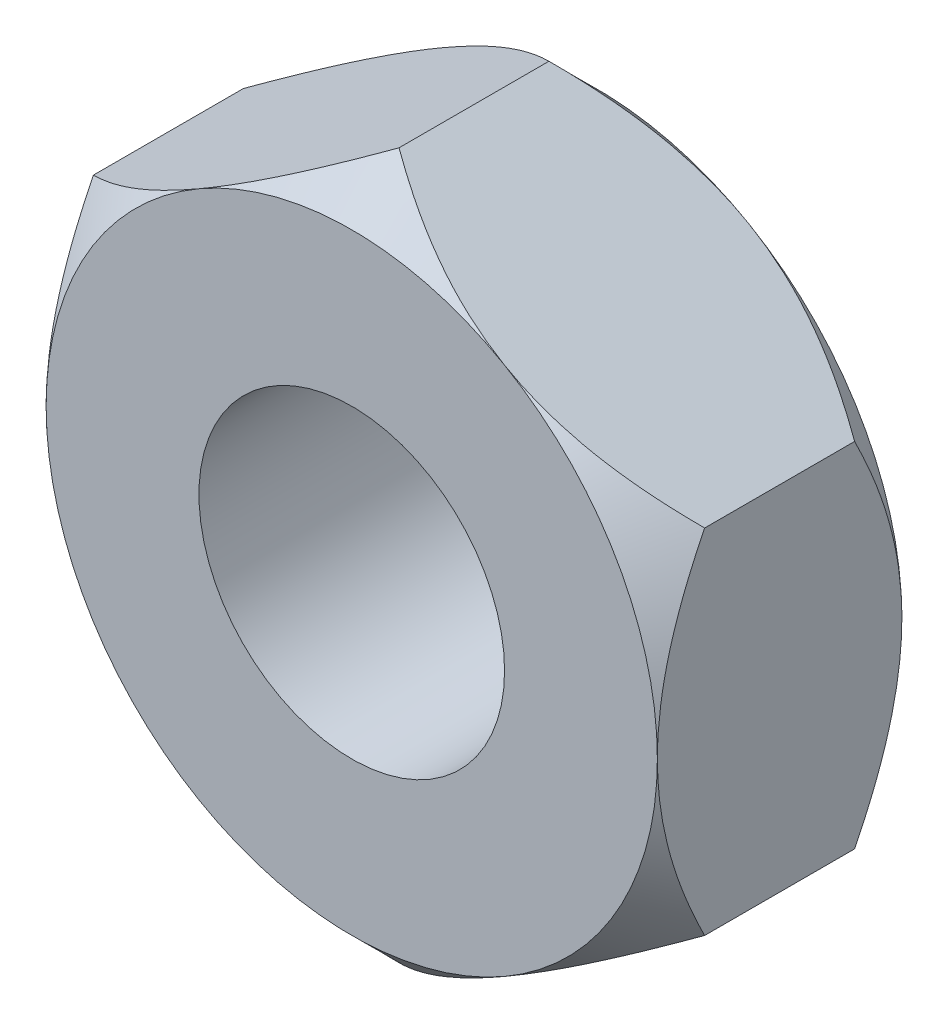
ISO-10303-21;
HEADER;
FILE_DESCRIPTION(('STEP AP214'),'2;1');
FILE_NAME('part.step','',(''),(''),'','','');
FILE_SCHEMA(('AUTOMOTIVE_DESIGN { 1 0 10303 214 1 1 1 1 }'));
ENDSEC;
DATA;
#1=APPLICATION_CONTEXT('core data for automotive mechanical design processes');
#2=APPLICATION_PROTOCOL_DEFINITION('international standard','automotive_design',2000,#1);
#3=PRODUCT_CONTEXT('',#1,'mechanical');
#4=PRODUCT('Part','Part','',(#3));
#5=PRODUCT_RELATED_PRODUCT_CATEGORY('part','',(#4));
#6=PRODUCT_DEFINITION_FORMATION('','',#4);
#7=PRODUCT_DEFINITION_CONTEXT('part definition',#1,'design');
#8=PRODUCT_DEFINITION('design','',#6,#7);
#9=PRODUCT_DEFINITION_SHAPE('','',#8);
#10=(LENGTH_UNIT() NAMED_UNIT(*) SI_UNIT(.MILLI.,.METRE.));
#11=(NAMED_UNIT(*) PLANE_ANGLE_UNIT() SI_UNIT($,.RADIAN.));
#12=(NAMED_UNIT(*) SI_UNIT($,.STERADIAN.) SOLID_ANGLE_UNIT());
#13=UNCERTAINTY_MEASURE_WITH_UNIT(LENGTH_MEASURE(1.E-05),#10,'distance_accuracy_value','');
#14=(GEOMETRIC_REPRESENTATION_CONTEXT(3) GLOBAL_UNCERTAINTY_ASSIGNED_CONTEXT((#13)) GLOBAL_UNIT_ASSIGNED_CONTEXT((#10,
#11,#12)) REPRESENTATION_CONTEXT('',''));
#15=CARTESIAN_POINT('',(0.,0.,0.));
#16=DIRECTION('',(0.,0.,1.));
#17=DIRECTION('',(1.,0.,0.));
#18=AXIS2_PLACEMENT_3D('',#15,#16,#17);
#19=CARTESIAN_POINT('',(2.5,1.44337567297407,2.));
#20=DIRECTION('',(-0.5,-0.866025403784439,0.));
#21=DIRECTION('',(0.866025403784439,-0.5,0.));
#22=AXIS2_PLACEMENT_3D('',#19,#20,#21);
#23=PLANE('',#22);
#24=CARTESIAN_POINT('',(-0.000199999999999123,2.88686681600197,0.386866822929891));
#25=CARTESIAN_POINT('',(0.0857382777877658,2.83725032818751,0.337292051302854));
#26=CARTESIAN_POINT('',(0.173113567275754,2.7868041812811,0.290628827310633));
#27=CARTESIAN_POINT('',(0.351281456165589,2.6839389026696,0.205189485986429));
#28=CARTESIAN_POINT('',(0.442091000681075,2.6315099876986,0.16646090835413));
#29=CARTESIAN_POINT('',(0.625204123126921,2.52578957716234,0.100118049845867));
#30=CARTESIAN_POINT('',(0.717461064529341,2.47252500720904,0.0723370144789845));
#31=CARTESIAN_POINT('',(0.904006008776286,2.3648232334321,0.0295345218587943));
#32=CARTESIAN_POINT('',(0.998288312566283,2.31038931995913,0.0144811126194724));
#33=CARTESIAN_POINT('',(1.16077825829185,2.21657570605387,0.000899068157609951));
#34=CARTESIAN_POINT('',(1.22877596788015,2.17731721011878,-0.00111155481107021));
#35=CARTESIAN_POINT('',(1.36466024116922,2.0988643883567,0.0022754631356168));
#36=CARTESIAN_POINT('',(1.43254675755224,2.05967008984862,0.00767570124794925));
#37=CARTESIAN_POINT('',(1.56767878823611,1.98165157555715,0.0255771343506008));
#38=CARTESIAN_POINT('',(1.63492349975356,1.94282782326097,0.0380862729946096));
#39=CARTESIAN_POINT('',(1.7682501008182,1.86585167424616,0.0695188479038358));
#40=CARTESIAN_POINT('',(1.83433207909966,1.82769922629678,0.0884417924449471));
#41=CARTESIAN_POINT('',(2.00359634669127,1.72997445583858,0.144618707356376));
#42=CARTESIAN_POINT('',(2.10572912222289,1.67100807039231,0.186107177544315));
#43=CARTESIAN_POINT('',(2.25590641494051,1.58430317001562,0.256145392671216));
#44=CARTESIAN_POINT('',(2.30539653988261,1.55573003305807,0.280753598064202));
#45=CARTESIAN_POINT('',(2.40346006383885,1.49911303110426,0.332213232663363));
#46=CARTESIAN_POINT('',(2.45203400349693,1.47106885396706,0.359063284727483));
#47=CARTESIAN_POINT('',(2.5002,1.44326020292023,0.386866822929891));
#48=B_SPLINE_CURVE_WITH_KNOTS('',3,(#24,#25,#26,#27,#28,#29,#30,#31,#32,#33,#34,#35,#36,#37,#38,
#39,#40,#41,#42,#43,#44,#45,#46,#47),.UNSPECIFIED.,.F.,.F.,(4,2,2,2,2,2,2,2,2,2,2,4),(0.,
0.333012085133924,0.667964518301397,0.997597032043298,1.32639954393844,1.56169424147168,
1.79707142102083,2.03271213522171,2.26833478775651,2.64260240809533,2.82922877818864,
3.01574133749025),.UNSPECIFIED.);
#49=CARTESIAN_POINT('',(0.,2.88675134594813,0.386751345948127));
#50=VERTEX_POINT('',#49);
#51=CARTESIAN_POINT('',(1.25,2.1650635094611,0.));
#52=VERTEX_POINT('',#51);
#53=EDGE_CURVE('E81',#50,#52,#48,.T.);
#54=ORIENTED_EDGE('',*,*,#53,.F.);
#55=DIRECTION('',(0.,0.,-1.));
#56=VECTOR('',#55,1.);
#57=CARTESIAN_POINT('',(0.,2.88675134594813,2.));
#58=LINE('',#57,#56);
#59=CARTESIAN_POINT('',(0.,2.88675134594813,1.61324865405187));
#60=VERTEX_POINT('',#59);
#61=EDGE_CURVE('E204',#60,#50,#58,.T.);
#62=ORIENTED_EDGE('',*,*,#61,.F.);
#63=CARTESIAN_POINT('',(2.5002,1.44326020292023,1.61313317707011));
#64=CARTESIAN_POINT('',(2.41426172221224,1.49287669073469,1.66270794869715));
#65=CARTESIAN_POINT('',(2.32688643272425,1.5433228376411,1.70937117268937));
#66=CARTESIAN_POINT('',(2.14871854383441,1.64618811625259,1.79481051401357));
#67=CARTESIAN_POINT('',(2.05790899931893,1.6986170312236,1.83353909164587));
#68=CARTESIAN_POINT('',(1.87479587687308,1.80433744175986,1.89988195015413));
#69=CARTESIAN_POINT('',(1.78253893547066,1.85760201171316,1.92766298552102));
#70=CARTESIAN_POINT('',(1.59599399122371,1.96530378549009,1.97046547814121));
#71=CARTESIAN_POINT('',(1.50171168743372,2.01973769896307,1.98551888738053));
#72=CARTESIAN_POINT('',(1.33922174170816,2.11355131286833,1.99910093184239));
#73=CARTESIAN_POINT('',(1.27122403211985,2.15280980880341,2.00111155481107));
#74=CARTESIAN_POINT('',(1.13533975883078,2.23126263056549,1.99772453686438));
#75=CARTESIAN_POINT('',(1.06745324244776,2.27045692907358,1.99232429875205));
#76=CARTESIAN_POINT('',(0.932321211763895,2.34847544336505,1.9744228656494));
#77=CARTESIAN_POINT('',(0.86507650024644,2.38729919566123,1.96191372700539));
#78=CARTESIAN_POINT('',(0.731749899181802,2.46427534467604,1.93048115209616));
#79=CARTESIAN_POINT('',(0.665667920900344,2.50242779262542,1.91155820755505));
#80=CARTESIAN_POINT('',(0.496403653308736,2.60015256308362,1.85538129264362));
#81=CARTESIAN_POINT('',(0.394270877777108,2.65911894852989,1.81389282245568));
#82=CARTESIAN_POINT('',(0.244093585059492,2.74582384890657,1.74385460732878));
#83=CARTESIAN_POINT('',(0.194603460117391,2.77439698586412,1.7192464019358));
#84=CARTESIAN_POINT('',(0.0965399361611536,2.83101398781794,1.66778676733664));
#85=CARTESIAN_POINT('',(0.0479659965030723,2.85905816495513,1.64093671527252));
#86=CARTESIAN_POINT('',(-0.000199999999999437,2.88686681600197,1.61313317707011));
#87=B_SPLINE_CURVE_WITH_KNOTS('',3,(#63,#64,#65,#66,#67,#68,#69,#70,#71,#72,#73,#74,#75,#76,#77,
#78,#79,#80,#81,#82,#83,#84,#85,#86),.UNSPECIFIED.,.F.,.F.,(4,2,2,2,2,2,2,2,2,2,2,4),(0.,
0.333012085133923,0.667964518301396,0.997597032043297,1.32639954393844,1.56169424147168,
1.79707142102083,2.0327121352217,2.2683347877565,2.64260240809533,2.82922877818864,
3.01574133749025),.UNSPECIFIED.);
#88=CARTESIAN_POINT('',(1.25,2.1650635094611,2.));
#89=VERTEX_POINT('',#88);
#90=EDGE_CURVE('E233',#89,#60,#87,.T.);
#91=ORIENTED_EDGE('',*,*,#90,.F.);
#92=CARTESIAN_POINT('',(2.5,1.44337567297407,1.61324865405187));
#93=VERTEX_POINT('',#92);
#94=EDGE_CURVE('E391',#93,#89,#87,.T.);
#95=ORIENTED_EDGE('',*,*,#94,.F.);
#96=DIRECTION('',(0.,0.,-1.));
#97=VECTOR('',#96,1.);
#98=CARTESIAN_POINT('',(2.5,1.44337567297407,2.));
#99=LINE('',#98,#97);
#100=CARTESIAN_POINT('',(2.5,1.44337567297407,0.386751345948127));
#101=VERTEX_POINT('',#100);
#102=EDGE_CURVE('E186',#93,#101,#99,.T.);
#103=ORIENTED_EDGE('',*,*,#102,.T.);
#104=EDGE_CURVE('E178',#52,#101,#48,.T.);
#105=ORIENTED_EDGE('',*,*,#104,.F.);
#106=EDGE_LOOP('',(#54,#62,#91,#95,#103,#105));
#107=FACE_BOUND('',#106,.T.);
#108=ADVANCED_FACE('F64',(#107),#23,.F.);
#109=CARTESIAN_POINT('',(0.,2.88675134594813,2.));
#110=DIRECTION('',(0.5,-0.866025403784439,0.));
#111=DIRECTION('',(0.866025403784439,0.5,0.));
#112=AXIS2_PLACEMENT_3D('',#109,#110,#111);
#113=PLANE('',#112);
#114=CARTESIAN_POINT('',(-2.5002,1.44326020292023,0.386866822929891));
#115=CARTESIAN_POINT('',(-2.41426172221224,1.49287669073469,0.337292051302855));
#116=CARTESIAN_POINT('',(-2.32688643272425,1.5433228376411,0.290628827310633));
#117=CARTESIAN_POINT('',(-2.14871854383441,1.64618811625259,0.205189485986428));
#118=CARTESIAN_POINT('',(-2.05790899931893,1.69861703122359,0.166460908354129));
#119=CARTESIAN_POINT('',(-1.87479587687308,1.80433744175986,0.100118049845866));
#120=CARTESIAN_POINT('',(-1.78253893547066,1.85760201171316,0.0723370144789839));
#121=CARTESIAN_POINT('',(-1.59599399122371,1.96530378549009,0.0295345218587938));
#122=CARTESIAN_POINT('',(-1.50171168743372,2.01973769896307,0.0144811126194717));
#123=CARTESIAN_POINT('',(-1.33922174170815,2.11355131286833,0.00089906815760948));
#124=CARTESIAN_POINT('',(-1.27122403211985,2.15280980880341,-0.00111155481107049));
#125=CARTESIAN_POINT('',(-1.13533975883078,2.23126263056549,0.00227546313561644));
#126=CARTESIAN_POINT('',(-1.06745324244776,2.27045692907358,0.00767570124794863));
#127=CARTESIAN_POINT('',(-0.932321211763894,2.34847544336505,0.0255771343505999));
#128=CARTESIAN_POINT('',(-0.86507650024644,2.38729919566123,0.0380862729946087));
#129=CARTESIAN_POINT('',(-0.731749899181801,2.46427534467604,0.0695188479038351));
#130=CARTESIAN_POINT('',(-0.665667920900343,2.50242779262542,0.0884417924449465));
#131=CARTESIAN_POINT('',(-0.496403653308735,2.60015256308362,0.144618707356375));
#132=CARTESIAN_POINT('',(-0.394270877777107,2.65911894852989,0.186107177544315));
#133=CARTESIAN_POINT('',(-0.244093585059491,2.74582384890657,0.256145392671216));
#134=CARTESIAN_POINT('',(-0.19460346011739,2.77439698586412,0.280753598064202));
#135=CARTESIAN_POINT('',(-0.0965399361611529,2.83101398781794,0.332213232663363));
#136=CARTESIAN_POINT('',(-0.0479659965030716,2.85905816495513,0.359063284727484));
#137=CARTESIAN_POINT('',(0.000200000000000612,2.88686681600197,0.386866822929892));
#138=B_SPLINE_CURVE_WITH_KNOTS('',3,(#114,#115,#116,#117,#118,#119,#120,#121,#122,#123,#124,
#125,#126,#127,#128,#129,#130,#131,#132,#133,#134,#135,#136,#137),.UNSPECIFIED.,.F.,.F.,(4,2,2,
2,2,2,2,2,2,2,2,4),(0.,0.333012085133924,0.667964518301397,0.997597032043299,1.32639954393844,
1.56169424147169,1.79707142102083,2.03271213522171,2.26833478775651,2.64260240809533,
2.82922877818864,3.01574133749025),.UNSPECIFIED.);
#139=CARTESIAN_POINT('',(-2.5,1.44337567297407,0.386751345948127));
#140=VERTEX_POINT('',#139);
#141=CARTESIAN_POINT('',(-1.25,2.1650635094611,0.));
#142=VERTEX_POINT('',#141);
#143=EDGE_CURVE('E88',#140,#142,#138,.T.);
#144=ORIENTED_EDGE('',*,*,#143,.F.);
#145=DIRECTION('',(0.,0.,-1.));
#146=VECTOR('',#145,1.);
#147=CARTESIAN_POINT('',(-2.5,1.44337567297407,2.));
#148=LINE('',#147,#146);
#149=CARTESIAN_POINT('',(-2.5,1.44337567297407,1.61324865405187));
#150=VERTEX_POINT('',#149);
#151=EDGE_CURVE('E200',#150,#140,#148,.T.);
#152=ORIENTED_EDGE('',*,*,#151,.F.);
#153=CARTESIAN_POINT('',(0.000200000000000938,2.88686681600197,1.61313317707011));
#154=CARTESIAN_POINT('',(-0.085738277787764,2.83725032818751,1.66270794869714));
#155=CARTESIAN_POINT('',(-0.173113567275753,2.7868041812811,1.70937117268937));
#156=CARTESIAN_POINT('',(-0.351281456165588,2.6839389026696,1.79481051401357));
#157=CARTESIAN_POINT('',(-0.442091000681074,2.6315099876986,1.83353909164587));
#158=CARTESIAN_POINT('',(-0.625204123126921,2.52578957716234,1.89988195015413));
#159=CARTESIAN_POINT('',(-0.71746106452934,2.47252500720904,1.92766298552102));
#160=CARTESIAN_POINT('',(-0.904006008776286,2.3648232334321,1.97046547814121));
#161=CARTESIAN_POINT('',(-0.998288312566284,2.31038931995913,1.98551888738053));
#162=CARTESIAN_POINT('',(-1.16077825829185,2.21657570605387,1.99910093184239));
#163=CARTESIAN_POINT('',(-1.22877596788015,2.17731721011878,2.00111155481107));
#164=CARTESIAN_POINT('',(-1.36466024116922,2.0988643883567,1.99772453686438));
#165=CARTESIAN_POINT('',(-1.43254675755224,2.05967008984862,1.99232429875205));
#166=CARTESIAN_POINT('',(-1.56767878823611,1.98165157555715,1.9744228656494));
#167=CARTESIAN_POINT('',(-1.63492349975356,1.94282782326097,1.96191372700539));
#168=CARTESIAN_POINT('',(-1.7682501008182,1.86585167424616,1.93048115209616));
#169=CARTESIAN_POINT('',(-1.83433207909966,1.82769922629678,1.91155820755505));
#170=CARTESIAN_POINT('',(-2.00359634669127,1.72997445583858,1.85538129264362));
#171=CARTESIAN_POINT('',(-2.10572912222289,1.67100807039231,1.81389282245568));
#172=CARTESIAN_POINT('',(-2.25590641494051,1.58430317001562,1.74385460732878));
#173=CARTESIAN_POINT('',(-2.30539653988261,1.55573003305807,1.7192464019358));
#174=CARTESIAN_POINT('',(-2.40346006383885,1.49911303110426,1.66778676733664));
#175=CARTESIAN_POINT('',(-2.45203400349693,1.47106885396706,1.64093671527252));
#176=CARTESIAN_POINT('',(-2.5002,1.44326020292023,1.61313317707011));
#177=B_SPLINE_CURVE_WITH_KNOTS('',3,(#153,#154,#155,#156,#157,#158,#159,#160,#161,#162,#163,
#164,#165,#166,#167,#168,#169,#170,#171,#172,#173,#174,#175,#176),.UNSPECIFIED.,.F.,.F.,(4,2,2,
2,2,2,2,2,2,2,2,4),(0.,0.333012085133925,0.667964518301398,0.9975970320433,1.32639954393844,
1.56169424147169,1.79707142102083,2.03271213522171,2.26833478775651,2.64260240809533,
2.82922877818864,3.01574133749025),.UNSPECIFIED.);
#178=CARTESIAN_POINT('',(-1.25,2.1650635094611,2.));
#179=VERTEX_POINT('',#178);
#180=EDGE_CURVE('E267',#179,#150,#177,.T.);
#181=ORIENTED_EDGE('',*,*,#180,.F.);
#182=EDGE_CURVE('E386',#60,#179,#177,.T.);
#183=ORIENTED_EDGE('',*,*,#182,.F.);
#184=ORIENTED_EDGE('',*,*,#61,.T.);
#185=EDGE_CURVE('E291',#142,#50,#138,.T.);
#186=ORIENTED_EDGE('',*,*,#185,.F.);
#187=EDGE_LOOP('',(#144,#152,#181,#183,#184,#186));
#188=FACE_BOUND('',#187,.T.);
#189=ADVANCED_FACE('F276',(#188),#113,.F.);
#190=CARTESIAN_POINT('',(-2.5,1.44337567297407,2.));
#191=DIRECTION('',(1.,0.,0.));
#192=DIRECTION('',(0.,0.,-1.));
#193=AXIS2_PLACEMENT_3D('',#190,#191,#192);
#194=PLANE('',#193);
#195=CARTESIAN_POINT('',(-2.5,-3.26567909405567,1.61274360316228));
#196=CARTESIAN_POINT('',(-2.5,-3.1876597357196,1.55080668033765));
#197=CARTESIAN_POINT('',(-2.5,-3.10925011326456,1.489354125676));
#198=CARTESIAN_POINT('',(-2.5,-2.9514810930779,1.36764674853936));
#199=CARTESIAN_POINT('',(-2.5,-2.87212149709823,1.30739218330598));
#200=CARTESIAN_POINT('',(-2.5,-2.71170975539801,1.1878844213843));
#201=CARTESIAN_POINT('',(-2.5,-2.63064933443876,1.12864229836218));
#202=CARTESIAN_POINT('',(-2.5,-2.46723546824709,1.01197598444938));
#203=CARTESIAN_POINT('',(-2.5,-2.38488210962282,0.954551672562324));
#204=CARTESIAN_POINT('',(-2.5,-2.21235850361717,0.837693856171788));
#205=CARTESIAN_POINT('',(-2.5,-2.12206811516737,0.778436853987641));
#206=CARTESIAN_POINT('',(-2.5,-1.93935936342298,0.663239415622614));
#207=CARTESIAN_POINT('',(-2.5,-1.84694060881695,0.607299596192161));
#208=CARTESIAN_POINT('',(-2.5,-1.65988899862695,0.499897293966413));
#209=CARTESIAN_POINT('',(-2.5,-1.56526367289385,0.448421799255685));
#210=CARTESIAN_POINT('',(-2.5,-1.37318301361869,0.351101364408174));
#211=CARTESIAN_POINT('',(-2.5,-1.27572913640846,0.3052535881608));
#212=CARTESIAN_POINT('',(-2.5,-1.09029639896578,0.226287254373349));
#213=CARTESIAN_POINT('',(-2.5,-1.00269511248596,0.192290940023052));
#214=CARTESIAN_POINT('',(-2.5,-0.825041993603072,0.131300227675575));
#215=CARTESIAN_POINT('',(-2.5,-0.73499002120457,0.104306230617392));
#216=CARTESIAN_POINT('',(-2.5,-0.554685314756036,0.0593415490779043));
#217=CARTESIAN_POINT('',(-2.5,-0.464478815244774,0.0411887793936117));
#218=CARTESIAN_POINT('',(-2.5,-0.28266267034721,0.0143250807741671));
#219=CARTESIAN_POINT('',(-2.5,-0.191053438302298,0.00561142273131899));
#220=CARTESIAN_POINT('',(-2.5,-0.0129543264737004,-0.00145424133300846));
#221=CARTESIAN_POINT('',(-2.5,0.0735120365543206,-0.000397976929628237));
#222=CARTESIAN_POINT('',(-2.5,0.245874267573356,0.0105883536211212));
#223=CARTESIAN_POINT('',(-2.5,0.331770091211446,0.0205191017096189));
#224=CARTESIAN_POINT('',(-2.5,0.503842956116674,0.0488246568319897));
#225=CARTESIAN_POINT('',(-2.5,0.589993280937961,0.0673591293116631));
#226=CARTESIAN_POINT('',(-2.5,0.760336458455045,0.111771145214337));
#227=CARTESIAN_POINT('',(-2.5,0.844529314798779,0.137648674951631));
#228=CARTESIAN_POINT('',(-2.5,1.09483730163166,0.22470731717284));
#229=CARTESIAN_POINT('',(-2.5,1.25774193664881,0.295134503606763));
#230=CARTESIAN_POINT('',(-2.5,1.49619216550169,0.412698798002814));
#231=CARTESIAN_POINT('',(-2.5,1.5748333423118,0.453962999838349));
#232=CARTESIAN_POINT('',(-2.5,1.73034188339433,0.53971560964884));
#233=CARTESIAN_POINT('',(-2.5,1.80720954752923,0.58420346722803));
#234=CARTESIAN_POINT('',(-2.5,1.95561959718083,0.673501697868622));
#235=CARTESIAN_POINT('',(-2.5,2.02723758587862,0.718187820400805));
#236=CARTESIAN_POINT('',(-2.5,2.16924442838932,0.809481081710537));
#237=CARTESIAN_POINT('',(-2.5,2.23963319114109,0.856088361955368));
#238=CARTESIAN_POINT('',(-2.5,2.37878146847468,0.950507988645337));
#239=CARTESIAN_POINT('',(-2.5,2.44754946719262,0.998307883594117));
#240=CARTESIAN_POINT('',(-2.5,2.58413952769418,1.09520282156358));
#241=CARTESIAN_POINT('',(-2.5,2.65196184465657,1.14429750444471));
#242=CARTESIAN_POINT('',(-2.5,2.71938704961064,1.19392283698374));
#243=B_SPLINE_CURVE_WITH_KNOTS('',3,(#195,#196,#197,#198,#199,#200,#201,#202,#203,#204,#205,
#206,#207,#208,#209,#210,#211,#212,#213,#214,#215,#216,#217,#218,#219,#220,#221,#222,#223,#224,
#225,#226,#227,#228,#229,#230,#231,#232,#233,#234,#235,#236,#237,#238,#239,#240,#241,#242),
.UNSPECIFIED.,.F.,.F.,(4,2,2,2,2,2,2,2,2,2,2,2,2,2,2,2,2,2,2,2,2,2,2,4),(0.,0.29885056163874,
0.597764616457264,0.898947760907934,1.20011081579959,1.52405067075365,1.84805056690858,
2.17107194014598,2.49392985127604,2.77559391837559,3.05727410945089,3.33287803908303,
3.60840226272653,3.86735363281682,4.12632490319451,4.39030698492101,4.65428857465111,
5.18509165483083,5.45149656772086,5.71785610225249,5.97107149106172,6.22430555918608,
6.47553611643667,6.72669751703712),.UNSPECIFIED.);
#244=CARTESIAN_POINT('',(-2.5,-1.44337567297406,0.386751345948127));
#245=VERTEX_POINT('',#244);
#246=CARTESIAN_POINT('',(-2.5,0.,0.));
#247=VERTEX_POINT('',#246);
#248=EDGE_CURVE('E289',#245,#247,#243,.T.);
#249=ORIENTED_EDGE('',*,*,#248,.F.);
#250=DIRECTION('',(0.,0.,-1.));
#251=VECTOR('',#250,1.);
#252=CARTESIAN_POINT('',(-2.5,-1.44337567297406,2.));
#253=LINE('',#252,#251);
#254=CARTESIAN_POINT('',(-2.5,-1.44337567297406,1.61324865405187));
#255=VERTEX_POINT('',#254);
#256=EDGE_CURVE('E190',#255,#245,#253,.T.);
#257=ORIENTED_EDGE('',*,*,#256,.F.);
#258=CARTESIAN_POINT('',(-2.5,-3.26567909405567,0.387256396837726));
#259=CARTESIAN_POINT('',(-2.5,-3.1876597357196,0.449193319662351));
#260=CARTESIAN_POINT('',(-2.5,-3.10925011326456,0.510645874324003));
#261=CARTESIAN_POINT('',(-2.5,-2.9514810930779,0.63235325146064));
#262=CARTESIAN_POINT('',(-2.5,-2.87212149709823,0.692607816694023));
#263=CARTESIAN_POINT('',(-2.5,-2.71170975539801,0.812115578615704));
#264=CARTESIAN_POINT('',(-2.5,-2.63064933443875,0.871357701637819));
#265=CARTESIAN_POINT('',(-2.5,-2.46723546824709,0.988024015550617));
#266=CARTESIAN_POINT('',(-2.5,-2.38488210962281,1.04544832743768));
#267=CARTESIAN_POINT('',(-2.5,-2.21235850361717,1.16230614382821));
#268=CARTESIAN_POINT('',(-2.5,-2.12206811516737,1.22156314601236));
#269=CARTESIAN_POINT('',(-2.5,-1.93935936342298,1.33676058437739));
#270=CARTESIAN_POINT('',(-2.5,-1.84694060881695,1.39270040380784));
#271=CARTESIAN_POINT('',(-2.5,-1.65988899862695,1.50010270603359));
#272=CARTESIAN_POINT('',(-2.5,-1.56526367289385,1.55157820074431));
#273=CARTESIAN_POINT('',(-2.5,-1.37318301361868,1.64889863559182));
#274=CARTESIAN_POINT('',(-2.5,-1.27572913640846,1.6947464118392));
#275=CARTESIAN_POINT('',(-2.5,-1.09029639896578,1.77371274562665));
#276=CARTESIAN_POINT('',(-2.5,-1.00269511248596,1.80770905997695));
#277=CARTESIAN_POINT('',(-2.5,-0.825041993603071,1.86869977232442));
#278=CARTESIAN_POINT('',(-2.5,-0.734990021204569,1.89569376938261));
#279=CARTESIAN_POINT('',(-2.5,-0.554685314756035,1.94065845092209));
#280=CARTESIAN_POINT('',(-2.5,-0.464478815244773,1.95881122060639));
#281=CARTESIAN_POINT('',(-2.5,-0.282662670347209,1.98567491922583));
#282=CARTESIAN_POINT('',(-2.5,-0.191053438302297,1.99438857726868));
#283=CARTESIAN_POINT('',(-2.5,-0.0129543264737001,2.00145424133301));
#284=CARTESIAN_POINT('',(-2.5,0.0735120365543206,2.00039797692963));
#285=CARTESIAN_POINT('',(-2.5,0.245874267573356,1.98941164637888));
#286=CARTESIAN_POINT('',(-2.5,0.331770091211445,1.97948089829038));
#287=CARTESIAN_POINT('',(-2.5,0.503842956116674,1.95117534316801));
#288=CARTESIAN_POINT('',(-2.5,0.589993280937961,1.93264087068834));
#289=CARTESIAN_POINT('',(-2.5,0.760336458455045,1.88822885478566));
#290=CARTESIAN_POINT('',(-2.5,0.844529314798779,1.86235132504837));
#291=CARTESIAN_POINT('',(-2.5,1.09483730163166,1.77529268282716));
#292=CARTESIAN_POINT('',(-2.5,1.25774193664881,1.70486549639324));
#293=CARTESIAN_POINT('',(-2.5,1.49619216550169,1.58730120199719));
#294=CARTESIAN_POINT('',(-2.5,1.5748333423118,1.54603700016165));
#295=CARTESIAN_POINT('',(-2.5,1.73034188339433,1.46028439035116));
#296=CARTESIAN_POINT('',(-2.5,1.80720954752923,1.41579653277197));
#297=CARTESIAN_POINT('',(-2.5,1.95561959718083,1.32649830213138));
#298=CARTESIAN_POINT('',(-2.5,2.02723758587862,1.28181217959919));
#299=CARTESIAN_POINT('',(-2.5,2.16924442838932,1.19051891828946));
#300=CARTESIAN_POINT('',(-2.5,2.23963319114109,1.14391163804463));
#301=CARTESIAN_POINT('',(-2.5,2.37878146847468,1.04949201135466));
#302=CARTESIAN_POINT('',(-2.5,2.44754946719262,1.00169211640588));
#303=CARTESIAN_POINT('',(-2.5,2.58413952769418,0.904797178436418));
#304=CARTESIAN_POINT('',(-2.5,2.65196184465657,0.855702495555293));
#305=CARTESIAN_POINT('',(-2.5,2.71938704961064,0.806077163016257));
#306=B_SPLINE_CURVE_WITH_KNOTS('',3,(#258,#259,#260,#261,#262,#263,#264,#265,#266,#267,#268,
#269,#270,#271,#272,#273,#274,#275,#276,#277,#278,#279,#280,#281,#282,#283,#284,#285,#286,#287,
#288,#289,#290,#291,#292,#293,#294,#295,#296,#297,#298,#299,#300,#301,#302,#303,#304,#305),
.UNSPECIFIED.,.F.,.F.,(4,2,2,2,2,2,2,2,2,2,2,2,2,2,2,2,2,2,2,2,2,2,2,4),(0.,0.29885056163874,
0.597764616457264,0.898947760907934,1.20011081579959,1.52405067075365,1.84805056690858,
2.17107194014598,2.49392985127604,2.77559391837559,3.05727410945089,3.33287803908302,
3.60840226272652,3.86735363281682,4.1263249031945,4.390306984921,4.65428857465111,
5.18509165483082,5.45149656772086,5.71785610225249,5.97107149106172,6.22430555918607,
6.47553611643666,6.72669751703712),.UNSPECIFIED.);
#307=CARTESIAN_POINT('',(-2.5,0.,2.));
#308=VERTEX_POINT('',#307);
#309=EDGE_CURVE('E258',#308,#255,#306,.F.);
#310=ORIENTED_EDGE('',*,*,#309,.F.);
#311=EDGE_CURVE('E265',#150,#308,#306,.F.);
#312=ORIENTED_EDGE('',*,*,#311,.F.);
#313=ORIENTED_EDGE('',*,*,#151,.T.);
#314=EDGE_CURVE('E282',#247,#140,#243,.T.);
#315=ORIENTED_EDGE('',*,*,#314,.F.);
#316=EDGE_LOOP('',(#249,#257,#310,#312,#313,#315));
#317=FACE_BOUND('',#316,.T.);
#318=ADVANCED_FACE('F272',(#317),#194,.F.);
#319=CARTESIAN_POINT('',(-2.5,-1.44337567297406,2.));
#320=DIRECTION('',(0.5,0.866025403784439,0.));
#321=DIRECTION('',(-0.866025403784439,0.5,0.));
#322=AXIS2_PLACEMENT_3D('',#319,#320,#321);
#323=PLANE('',#322);
#324=CARTESIAN_POINT('',(0.000199999999998779,-2.88686681600197,0.38686682292989));
#325=CARTESIAN_POINT('',(-0.085738277787766,-2.83725032818751,0.337292051302853));
#326=CARTESIAN_POINT('',(-0.173113567275755,-2.7868041812811,0.290628827310631));
#327=CARTESIAN_POINT('',(-0.35128145616559,-2.6839389026696,0.205189485986427));
#328=CARTESIAN_POINT('',(-0.442091000681076,-2.6315099876986,0.166460908354128));
#329=CARTESIAN_POINT('',(-0.625204123126922,-2.52578957716234,0.100118049845865));
#330=CARTESIAN_POINT('',(-0.717461064529342,-2.47252500720904,0.0723370144789827));
#331=CARTESIAN_POINT('',(-0.904006008776287,-2.3648232334321,0.0295345218587928));
#332=CARTESIAN_POINT('',(-0.998288312566284,-2.31038931995913,0.014481112619471));
#333=CARTESIAN_POINT('',(-1.16077825829185,-2.21657570605387,0.000899068157608689));
#334=CARTESIAN_POINT('',(-1.22877596788015,-2.17731721011878,-0.00111155481107148));
#335=CARTESIAN_POINT('',(-1.36466024116922,-2.0988643883567,0.00227546313561548));
#336=CARTESIAN_POINT('',(-1.43254675755224,-2.05967008984862,0.00767570124794789));
#337=CARTESIAN_POINT('',(-1.56767878823611,-1.98165157555715,0.0255771343505996));
#338=CARTESIAN_POINT('',(-1.63492349975356,-1.94282782326097,0.0380862729946085));
#339=CARTESIAN_POINT('',(-1.7682501008182,-1.86585167424616,0.0695188479038349));
#340=CARTESIAN_POINT('',(-1.83433207909966,-1.82769922629678,0.0884417924449463));
#341=CARTESIAN_POINT('',(-2.00359634669127,-1.72997445583858,0.144618707356375));
#342=CARTESIAN_POINT('',(-2.10572912222289,-1.67100807039231,0.186107177544315));
#343=CARTESIAN_POINT('',(-2.25590641494051,-1.58430317001562,0.256145392671216));
#344=CARTESIAN_POINT('',(-2.30539653988261,-1.55573003305807,0.280753598064201));
#345=CARTESIAN_POINT('',(-2.40346006383885,-1.49911303110426,0.332213232663363));
#346=CARTESIAN_POINT('',(-2.45203400349693,-1.47106885396706,0.359063284727483));
#347=CARTESIAN_POINT('',(-2.5002,-1.44326020292023,0.386866822929891));
#348=B_SPLINE_CURVE_WITH_KNOTS('',3,(#324,#325,#326,#327,#328,#329,#330,#331,#332,#333,#334,
#335,#336,#337,#338,#339,#340,#341,#342,#343,#344,#345,#346,#347),.UNSPECIFIED.,.F.,.F.,(4,2,2,
2,2,2,2,2,2,2,2,4),(0.,0.333012085133924,0.667964518301397,0.997597032043299,1.32639954393844,
1.56169424147169,1.79707142102083,2.03271213522171,2.26833478775651,2.64260240809533,
2.82922877818864,3.01574133749025),.UNSPECIFIED.);
#349=CARTESIAN_POINT('',(0.,-2.88675134594813,0.386751345948126));
#350=VERTEX_POINT('',#349);
#351=CARTESIAN_POINT('',(-1.25,-2.1650635094611,0.));
#352=VERTEX_POINT('',#351);
#353=EDGE_CURVE('E345',#350,#352,#348,.T.);
#354=ORIENTED_EDGE('',*,*,#353,.F.);
#355=DIRECTION('',(0.,0.,-1.));
#356=VECTOR('',#355,1.);
#357=CARTESIAN_POINT('',(0.,-2.88675134594813,2.));
#358=LINE('',#357,#356);
#359=CARTESIAN_POINT('',(0.,-2.88675134594813,1.61324865405187));
#360=VERTEX_POINT('',#359);
#361=EDGE_CURVE('E185',#360,#350,#358,.T.);
#362=ORIENTED_EDGE('',*,*,#361,.F.);
#363=CARTESIAN_POINT('',(-2.5002,-1.44326020292023,1.61313317707011));
#364=CARTESIAN_POINT('',(-2.41426172221224,-1.49287669073469,1.66270794869715));
#365=CARTESIAN_POINT('',(-2.32688643272425,-1.5433228376411,1.70937117268937));
#366=CARTESIAN_POINT('',(-2.14871854383441,-1.64618811625259,1.79481051401357));
#367=CARTESIAN_POINT('',(-2.05790899931893,-1.69861703122359,1.83353909164587));
#368=CARTESIAN_POINT('',(-1.87479587687308,-1.80433744175986,1.89988195015413));
#369=CARTESIAN_POINT('',(-1.78253893547066,-1.85760201171316,1.92766298552102));
#370=CARTESIAN_POINT('',(-1.59599399122371,-1.96530378549009,1.97046547814121));
#371=CARTESIAN_POINT('',(-1.50171168743372,-2.01973769896307,1.98551888738053));
#372=CARTESIAN_POINT('',(-1.33922174170815,-2.11355131286833,1.99910093184239));
#373=CARTESIAN_POINT('',(-1.27122403211985,-2.15280980880341,2.00111155481107));
#374=CARTESIAN_POINT('',(-1.13533975883078,-2.23126263056549,1.99772453686438));
#375=CARTESIAN_POINT('',(-1.06745324244776,-2.27045692907358,1.99232429875205));
#376=CARTESIAN_POINT('',(-0.932321211763893,-2.34847544336505,1.9744228656494));
#377=CARTESIAN_POINT('',(-0.865076500246438,-2.38729919566123,1.96191372700539));
#378=CARTESIAN_POINT('',(-0.7317498991818,-2.46427534467604,1.93048115209616));
#379=CARTESIAN_POINT('',(-0.665667920900342,-2.50242779262542,1.91155820755505));
#380=CARTESIAN_POINT('',(-0.496403653308734,-2.60015256308362,1.85538129264362));
#381=CARTESIAN_POINT('',(-0.394270877777107,-2.65911894852989,1.81389282245568));
#382=CARTESIAN_POINT('',(-0.244093585059491,-2.74582384890657,1.74385460732878));
#383=CARTESIAN_POINT('',(-0.194603460117391,-2.77439698586412,1.7192464019358));
#384=CARTESIAN_POINT('',(-0.096539936161154,-2.83101398781794,1.66778676733664));
#385=CARTESIAN_POINT('',(-0.047965996503073,-2.85905816495513,1.64093671527252));
#386=CARTESIAN_POINT('',(0.000199999999998885,-2.88686681600197,1.61313317707011));
#387=B_SPLINE_CURVE_WITH_KNOTS('',3,(#363,#364,#365,#366,#367,#368,#369,#370,#371,#372,#373,
#374,#375,#376,#377,#378,#379,#380,#381,#382,#383,#384,#385,#386),.UNSPECIFIED.,.F.,.F.,(4,2,2,
2,2,2,2,2,2,2,2,4),(0.,0.333012085133924,0.667964518301398,0.9975970320433,1.32639954393844,
1.56169424147169,1.79707142102083,2.03271213522171,2.26833478775651,2.64260240809533,
2.82922877818864,3.01574133749025),.UNSPECIFIED.);
#388=CARTESIAN_POINT('',(-1.25,-2.1650635094611,2.));
#389=VERTEX_POINT('',#388);
#390=EDGE_CURVE('E251',#389,#360,#387,.T.);
#391=ORIENTED_EDGE('',*,*,#390,.F.);
#392=EDGE_CURVE('E266',#255,#389,#387,.T.);
#393=ORIENTED_EDGE('',*,*,#392,.F.);
#394=ORIENTED_EDGE('',*,*,#256,.T.);
#395=EDGE_CURVE('E290',#352,#245,#348,.T.);
#396=ORIENTED_EDGE('',*,*,#395,.F.);
#397=EDGE_LOOP('',(#354,#362,#391,#393,#394,#396));
#398=FACE_BOUND('',#397,.T.);
#399=ADVANCED_FACE('F275',(#398),#323,.F.);
#400=CARTESIAN_POINT('',(0.,-2.88675134594813,2.));
#401=DIRECTION('',(-0.5,0.866025403784438,0.));
#402=DIRECTION('',(-0.866025403784439,-0.5,0.));
#403=AXIS2_PLACEMENT_3D('',#400,#401,#402);
#404=PLANE('',#403);
#405=CARTESIAN_POINT('',(2.5002,-1.44326020292022,0.386866822929889));
#406=CARTESIAN_POINT('',(2.41426172221223,-1.49287669073468,0.337292051302852));
#407=CARTESIAN_POINT('',(2.32688643272425,-1.5433228376411,0.290628827310631));
#408=CARTESIAN_POINT('',(2.14871854383441,-1.64618811625259,0.205189485986426));
#409=CARTESIAN_POINT('',(2.05790899931892,-1.69861703122359,0.166460908354127));
#410=CARTESIAN_POINT('',(1.87479587687308,-1.80433744175985,0.100118049845864));
#411=CARTESIAN_POINT('',(1.78253893547066,-1.85760201171315,0.0723370144789816));
#412=CARTESIAN_POINT('',(1.59599399122371,-1.96530378549009,0.0295345218587914));
#413=CARTESIAN_POINT('',(1.50171168743372,-2.01973769896306,0.0144811126194694));
#414=CARTESIAN_POINT('',(1.33922174170815,-2.11355131286833,0.000899068157607248));
#415=CARTESIAN_POINT('',(1.27122403211985,-2.15280980880341,-0.0011115548110727));
#416=CARTESIAN_POINT('',(1.13533975883078,-2.23126263056549,0.00227546313561431));
#417=CARTESIAN_POINT('',(1.06745324244776,-2.27045692907357,0.00767570124794653));
#418=CARTESIAN_POINT('',(0.932321211763893,-2.34847544336505,0.0255771343505981));
#419=CARTESIAN_POINT('',(0.865076500246439,-2.38729919566123,0.0380862729946071));
#420=CARTESIAN_POINT('',(0.731749899181801,-2.46427534467603,0.0695188479038335));
#421=CARTESIAN_POINT('',(0.665667920900343,-2.50242779262542,0.0884417924449447));
#422=CARTESIAN_POINT('',(0.496403653308735,-2.60015256308362,0.144618707356373));
#423=CARTESIAN_POINT('',(0.394270877777106,-2.65911894852989,0.186107177544313));
#424=CARTESIAN_POINT('',(0.24409358505949,-2.74582384890657,0.256145392671214));
#425=CARTESIAN_POINT('',(0.19460346011739,-2.77439698586412,0.2807535980642));
#426=CARTESIAN_POINT('',(0.0965399361611521,-2.83101398781794,0.332213232663362));
#427=CARTESIAN_POINT('',(0.0479659965030709,-2.85905816495513,0.359063284727482));
#428=CARTESIAN_POINT('',(-0.00020000000000142,-2.88686681600197,0.38686682292989));
#429=B_SPLINE_CURVE_WITH_KNOTS('',3,(#405,#406,#407,#408,#409,#410,#411,#412,#413,#414,#415,
#416,#417,#418,#419,#420,#421,#422,#423,#424,#425,#426,#427,#428),.UNSPECIFIED.,.F.,.F.,(4,2,2,
2,2,2,2,2,2,2,2,4),(0.,0.333012085133924,0.667964518301397,0.997597032043299,1.32639954393844,
1.56169424147169,1.79707142102083,2.03271213522171,2.26833478775651,2.64260240809533,
2.82922877818864,3.01574133749025),.UNSPECIFIED.);
#430=CARTESIAN_POINT('',(2.5,-1.44337567297406,0.386751345948125));
#431=VERTEX_POINT('',#430);
#432=CARTESIAN_POINT('',(1.25,-2.1650635094611,0.));
#433=VERTEX_POINT('',#432);
#434=EDGE_CURVE('E159',#431,#433,#429,.T.);
#435=ORIENTED_EDGE('',*,*,#434,.F.);
#436=DIRECTION('',(0.,0.,-1.));
#437=VECTOR('',#436,1.);
#438=CARTESIAN_POINT('',(2.5,-1.44337567297406,2.));
#439=LINE('',#438,#437);
#440=CARTESIAN_POINT('',(2.5,-1.44337567297406,1.61324865405187));
#441=VERTEX_POINT('',#440);
#442=EDGE_CURVE('E174',#441,#431,#439,.T.);
#443=ORIENTED_EDGE('',*,*,#442,.F.);
#444=CARTESIAN_POINT('',(-0.000200000000001161,-2.88686681600197,1.61313317707011));
#445=CARTESIAN_POINT('',(0.085738277787764,-2.83725032818751,1.66270794869715));
#446=CARTESIAN_POINT('',(0.173113567275753,-2.7868041812811,1.70937117268937));
#447=CARTESIAN_POINT('',(0.351281456165588,-2.6839389026696,1.79481051401357));
#448=CARTESIAN_POINT('',(0.442091000681074,-2.6315099876986,1.83353909164587));
#449=CARTESIAN_POINT('',(0.625204123126921,-2.52578957716234,1.89988195015414));
#450=CARTESIAN_POINT('',(0.71746106452934,-2.47252500720904,1.92766298552102));
#451=CARTESIAN_POINT('',(0.904006008776286,-2.3648232334321,1.97046547814121));
#452=CARTESIAN_POINT('',(0.998288312566284,-2.31038931995913,1.98551888738053));
#453=CARTESIAN_POINT('',(1.16077825829185,-2.21657570605387,1.99910093184239));
#454=CARTESIAN_POINT('',(1.22877596788015,-2.17731721011878,2.00111155481107));
#455=CARTESIAN_POINT('',(1.36466024116922,-2.0988643883567,1.99772453686439));
#456=CARTESIAN_POINT('',(1.43254675755224,-2.05967008984862,1.99232429875205));
#457=CARTESIAN_POINT('',(1.56767878823611,-1.98165157555714,1.9744228656494));
#458=CARTESIAN_POINT('',(1.63492349975356,-1.94282782326096,1.96191372700539));
#459=CARTESIAN_POINT('',(1.7682501008182,-1.86585167424616,1.93048115209617));
#460=CARTESIAN_POINT('',(1.83433207909966,-1.82769922629677,1.91155820755505));
#461=CARTESIAN_POINT('',(2.00359634669126,-1.72997445583857,1.85538129264363));
#462=CARTESIAN_POINT('',(2.10572912222289,-1.67100807039231,1.81389282245569));
#463=CARTESIAN_POINT('',(2.25590641494051,-1.58430317001562,1.74385460732879));
#464=CARTESIAN_POINT('',(2.30539653988261,-1.55573003305807,1.7192464019358));
#465=CARTESIAN_POINT('',(2.40346006383885,-1.49911303110425,1.66778676733664));
#466=CARTESIAN_POINT('',(2.45203400349693,-1.47106885396706,1.64093671527252));
#467=CARTESIAN_POINT('',(2.5002,-1.44326020292022,1.61313317707011));
#468=B_SPLINE_CURVE_WITH_KNOTS('',3,(#444,#445,#446,#447,#448,#449,#450,#451,#452,#453,#454,
#455,#456,#457,#458,#459,#460,#461,#462,#463,#464,#465,#466,#467),.UNSPECIFIED.,.F.,.F.,(4,2,2,
2,2,2,2,2,2,2,2,4),(0.,0.333012085133925,0.667964518301398,0.997597032043301,1.32639954393845,
1.56169424147169,1.79707142102083,2.03271213522171,2.26833478775651,2.64260240809533,
2.82922877818864,3.01574133749025),.UNSPECIFIED.);
#469=CARTESIAN_POINT('',(1.25,-2.1650635094611,2.));
#470=VERTEX_POINT('',#469);
#471=EDGE_CURVE('E244',#470,#441,#468,.T.);
#472=ORIENTED_EDGE('',*,*,#471,.F.);
#473=EDGE_CURVE('E308',#360,#470,#468,.T.);
#474=ORIENTED_EDGE('',*,*,#473,.F.);
#475=ORIENTED_EDGE('',*,*,#361,.T.);
#476=EDGE_CURVE('E176',#433,#350,#429,.T.);
#477=ORIENTED_EDGE('',*,*,#476,.F.);
#478=EDGE_LOOP('',(#435,#443,#472,#474,#475,#477));
#479=FACE_BOUND('',#478,.T.);
#480=ADVANCED_FACE('F172',(#479),#404,.F.);
#481=CARTESIAN_POINT('',(2.5,-1.44337567297406,2.));
#482=DIRECTION('',(-1.,0.,0.));
#483=DIRECTION('',(0.,0.,1.));
#484=AXIS2_PLACEMENT_3D('',#481,#482,#483);
#485=PLANE('',#484);
#486=CARTESIAN_POINT('',(2.5,-3.26567909405567,1.61274360316227));
#487=CARTESIAN_POINT('',(2.5,-3.1876597357196,1.55080668033765));
#488=CARTESIAN_POINT('',(2.5,-3.10925011326456,1.489354125676));
#489=CARTESIAN_POINT('',(2.5,-2.95148109307789,1.36764674853936));
#490=CARTESIAN_POINT('',(2.5,-2.87212149709823,1.30739218330598));
#491=CARTESIAN_POINT('',(2.5,-2.71170975539801,1.18788442138429));
#492=CARTESIAN_POINT('',(2.5,-2.63064933443875,1.12864229836218));
#493=CARTESIAN_POINT('',(2.5,-2.46723546824709,1.01197598444938));
#494=CARTESIAN_POINT('',(2.5,-2.38488210962281,0.954551672562321));
#495=CARTESIAN_POINT('',(2.5,-2.21235850361717,0.837693856171785));
#496=CARTESIAN_POINT('',(2.5,-2.12206811516737,0.778436853987639));
#497=CARTESIAN_POINT('',(2.5,-1.93935936342298,0.663239415622612));
#498=CARTESIAN_POINT('',(2.5,-1.84694060881695,0.607299596192158));
#499=CARTESIAN_POINT('',(2.5,-1.65988899862695,0.499897293966411));
#500=CARTESIAN_POINT('',(2.5,-1.56526367289385,0.448421799255683));
#501=CARTESIAN_POINT('',(2.5,-1.37318301361868,0.351101364408172));
#502=CARTESIAN_POINT('',(2.5,-1.27572913640846,0.305253588160798));
#503=CARTESIAN_POINT('',(2.5,-1.09029639896578,0.226287254373347));
#504=CARTESIAN_POINT('',(2.5,-1.00269511248596,0.192290940023051));
#505=CARTESIAN_POINT('',(2.5,-0.825041993603071,0.131300227675573));
#506=CARTESIAN_POINT('',(2.5,-0.73499002120457,0.10430623061739));
#507=CARTESIAN_POINT('',(2.5,-0.554685314756036,0.0593415490779029));
#508=CARTESIAN_POINT('',(2.5,-0.464478815244773,0.04118877939361));
#509=CARTESIAN_POINT('',(2.5,-0.282662670347209,0.0143250807741654));
#510=CARTESIAN_POINT('',(2.5,-0.191053438302297,0.00561142273131758));
#511=CARTESIAN_POINT('',(2.5,-0.0129543264736999,-0.00145424133300967));
#512=CARTESIAN_POINT('',(2.5,0.0735120365543209,-0.000397976929629503));
#513=CARTESIAN_POINT('',(2.5,0.245874267573356,0.0105883536211199));
#514=CARTESIAN_POINT('',(2.5,0.331770091211446,0.0205191017096176));
#515=CARTESIAN_POINT('',(2.5,0.503842956116674,0.0488246568319884));
#516=CARTESIAN_POINT('',(2.5,0.589993280937961,0.0673591293116619));
#517=CARTESIAN_POINT('',(2.5,0.760336458455045,0.111771145214336));
#518=CARTESIAN_POINT('',(2.5,0.844529314798779,0.13764867495163));
#519=CARTESIAN_POINT('',(2.5,1.09483730163166,0.224707317172838));
#520=CARTESIAN_POINT('',(2.5,1.25774193664881,0.295134503606762));
#521=CARTESIAN_POINT('',(2.5,1.49619216550169,0.412698798002813));
#522=CARTESIAN_POINT('',(2.5,1.5748333423118,0.453962999838348));
#523=CARTESIAN_POINT('',(2.5,1.73034188339433,0.539715609648839));
#524=CARTESIAN_POINT('',(2.5,1.80720954752924,0.584203467228029));
#525=CARTESIAN_POINT('',(2.5,1.95561959718083,0.673501697868622));
#526=CARTESIAN_POINT('',(2.5,2.02723758587862,0.718187820400805));
#527=CARTESIAN_POINT('',(2.5,2.16924442838933,0.809481081710537));
#528=CARTESIAN_POINT('',(2.5,2.23963319114109,0.856088361955368));
#529=CARTESIAN_POINT('',(2.5,2.37878146847468,0.950507988645337));
#530=CARTESIAN_POINT('',(2.5,2.44754946719262,0.998307883594117));
#531=CARTESIAN_POINT('',(2.5,2.58413952769418,1.09520282156358));
#532=CARTESIAN_POINT('',(2.5,2.65196184465657,1.14429750444471));
#533=CARTESIAN_POINT('',(2.5,2.71938704961064,1.19392283698374));
#534=B_SPLINE_CURVE_WITH_KNOTS('',3,(#486,#487,#488,#489,#490,#491,#492,#493,#494,#495,#496,
#497,#498,#499,#500,#501,#502,#503,#504,#505,#506,#507,#508,#509,#510,#511,#512,#513,#514,#515,
#516,#517,#518,#519,#520,#521,#522,#523,#524,#525,#526,#527,#528,#529,#530,#531,#532,#533),
.UNSPECIFIED.,.F.,.F.,(4,2,2,2,2,2,2,2,2,2,2,2,2,2,2,2,2,2,2,2,2,2,2,4),(0.,0.29885056163874,
0.597764616457264,0.898947760907935,1.20011081579959,1.52405067075365,1.84805056690858,
2.17107194014598,2.49392985127604,2.77559391837559,3.05727410945089,3.33287803908302,
3.60840226272652,3.86735363281682,4.1263249031945,4.390306984921,4.65428857465111,
5.18509165483082,5.45149656772086,5.71785610225249,5.97107149106172,6.22430555918608,
6.47553611643667,6.72669751703712),.UNSPECIFIED.);
#535=CARTESIAN_POINT('',(2.5,0.,0.));
#536=VERTEX_POINT('',#535);
#537=EDGE_CURVE('E166',#101,#536,#534,.F.);
#538=ORIENTED_EDGE('',*,*,#537,.F.);
#539=ORIENTED_EDGE('',*,*,#102,.F.);
#540=CARTESIAN_POINT('',(2.5,-3.26567909405567,0.387256396837727));
#541=CARTESIAN_POINT('',(2.5,-3.1876597357196,0.449193319662352));
#542=CARTESIAN_POINT('',(2.5,-3.10925011326456,0.510645874324003));
#543=CARTESIAN_POINT('',(2.5,-2.9514810930779,0.63235325146064));
#544=CARTESIAN_POINT('',(2.5,-2.87212149709823,0.692607816694023));
#545=CARTESIAN_POINT('',(2.5,-2.71170975539801,0.812115578615705));
#546=CARTESIAN_POINT('',(2.5,-2.63064933443875,0.871357701637821));
#547=CARTESIAN_POINT('',(2.5,-2.46723546824709,0.988024015550618));
#548=CARTESIAN_POINT('',(2.5,-2.38488210962281,1.04544832743768));
#549=CARTESIAN_POINT('',(2.5,-2.21235850361717,1.16230614382821));
#550=CARTESIAN_POINT('',(2.5,-2.12206811516737,1.22156314601236));
#551=CARTESIAN_POINT('',(2.5,-1.93935936342298,1.33676058437739));
#552=CARTESIAN_POINT('',(2.5,-1.84694060881695,1.39270040380784));
#553=CARTESIAN_POINT('',(2.5,-1.65988899862695,1.50010270603359));
#554=CARTESIAN_POINT('',(2.5,-1.56526367289385,1.55157820074432));
#555=CARTESIAN_POINT('',(2.5,-1.37318301361868,1.64889863559183));
#556=CARTESIAN_POINT('',(2.5,-1.27572913640846,1.6947464118392));
#557=CARTESIAN_POINT('',(2.5,-1.09029639896578,1.77371274562665));
#558=CARTESIAN_POINT('',(2.5,-1.00269511248596,1.80770905997695));
#559=CARTESIAN_POINT('',(2.5,-0.825041993603071,1.86869977232443));
#560=CARTESIAN_POINT('',(2.5,-0.734990021204569,1.89569376938261));
#561=CARTESIAN_POINT('',(2.5,-0.554685314756035,1.9406584509221));
#562=CARTESIAN_POINT('',(2.5,-0.464478815244773,1.95881122060639));
#563=CARTESIAN_POINT('',(2.5,-0.282662670347208,1.98567491922583));
#564=CARTESIAN_POINT('',(2.5,-0.191053438302297,1.99438857726868));
#565=CARTESIAN_POINT('',(2.5,-0.0129543264736993,2.00145424133301));
#566=CARTESIAN_POINT('',(2.5,0.0735120365543214,2.00039797692963));
#567=CARTESIAN_POINT('',(2.5,0.245874267573356,1.98941164637888));
#568=CARTESIAN_POINT('',(2.5,0.331770091211446,1.97948089829038));
#569=CARTESIAN_POINT('',(2.5,0.503842956116675,1.95117534316801));
#570=CARTESIAN_POINT('',(2.5,0.589993280937962,1.93264087068834));
#571=CARTESIAN_POINT('',(2.5,0.760336458455045,1.88822885478566));
#572=CARTESIAN_POINT('',(2.5,0.844529314798779,1.86235132504837));
#573=CARTESIAN_POINT('',(2.5,1.09483730163166,1.77529268282716));
#574=CARTESIAN_POINT('',(2.5,1.25774193664881,1.70486549639324));
#575=CARTESIAN_POINT('',(2.5,1.49619216550169,1.58730120199719));
#576=CARTESIAN_POINT('',(2.5,1.5748333423118,1.54603700016165));
#577=CARTESIAN_POINT('',(2.5,1.73034188339433,1.46028439035116));
#578=CARTESIAN_POINT('',(2.5,1.80720954752924,1.41579653277197));
#579=CARTESIAN_POINT('',(2.5,1.95561959718083,1.32649830213138));
#580=CARTESIAN_POINT('',(2.5,2.02723758587862,1.28181217959919));
#581=CARTESIAN_POINT('',(2.5,2.16924442838933,1.19051891828946));
#582=CARTESIAN_POINT('',(2.5,2.23963319114109,1.14391163804463));
#583=CARTESIAN_POINT('',(2.5,2.37878146847468,1.04949201135466));
#584=CARTESIAN_POINT('',(2.5,2.44754946719262,1.00169211640588));
#585=CARTESIAN_POINT('',(2.5,2.58413952769418,0.904797178436418));
#586=CARTESIAN_POINT('',(2.5,2.65196184465657,0.855702495555294));
#587=CARTESIAN_POINT('',(2.5,2.71938704961064,0.806077163016258));
#588=B_SPLINE_CURVE_WITH_KNOTS('',3,(#540,#541,#542,#543,#544,#545,#546,#547,#548,#549,#550,
#551,#552,#553,#554,#555,#556,#557,#558,#559,#560,#561,#562,#563,#564,#565,#566,#567,#568,#569,
#570,#571,#572,#573,#574,#575,#576,#577,#578,#579,#580,#581,#582,#583,#584,#585,#586,#587),
.UNSPECIFIED.,.F.,.F.,(4,2,2,2,2,2,2,2,2,2,2,2,2,2,2,2,2,2,2,2,2,2,2,4),(0.,0.29885056163874,
0.597764616457264,0.898947760907934,1.20011081579959,1.52405067075365,1.84805056690858,
2.17107194014598,2.49392985127604,2.77559391837559,3.05727410945089,3.33287803908302,
3.60840226272652,3.86735363281682,4.1263249031945,4.390306984921,4.65428857465111,
5.18509165483082,5.45149656772086,5.71785610225249,5.97107149106172,6.22430555918607,
6.47553611643667,6.72669751703712),.UNSPECIFIED.);
#589=CARTESIAN_POINT('',(2.5,0.,2.));
#590=VERTEX_POINT('',#589);
#591=EDGE_CURVE('E207',#590,#93,#588,.T.);
#592=ORIENTED_EDGE('',*,*,#591,.F.);
#593=EDGE_CURVE('E183',#441,#590,#588,.T.);
#594=ORIENTED_EDGE('',*,*,#593,.F.);
#595=ORIENTED_EDGE('',*,*,#442,.T.);
#596=EDGE_CURVE('E156',#536,#431,#534,.F.);
#597=ORIENTED_EDGE('',*,*,#596,.F.);
#598=EDGE_LOOP('',(#538,#539,#592,#594,#595,#597));
#599=FACE_BOUND('',#598,.T.);
#600=ADVANCED_FACE('F181',(#599),#485,.F.);
#601=CARTESIAN_POINT('',(0.,0.,0.));
#602=DIRECTION('',(0.,0.,1.));
#603=DIRECTION('',(1.,0.,0.));
#604=AXIS2_PLACEMENT_3D('',#601,#602,#603);
#605=PLANE('',#604);
#606=CARTESIAN_POINT('',(0.,0.,0.));
#607=DIRECTION('',(0.,0.,1.));
#608=DIRECTION('',(1.,0.,0.));
#609=AXIS2_PLACEMENT_3D('',#606,#607,#608);
#610=CIRCLE('',#609,1.25);
#611=CARTESIAN_POINT('',(1.25,0.,0.));
#612=VERTEX_POINT('',#611);
#613=EDGE_CURVE('E407',#612,#612,#610,.T.);
#614=ORIENTED_EDGE('',*,*,#613,.T.);
#615=EDGE_LOOP('',(#614));
#616=FACE_BOUND('',#615,.T.);
#617=CARTESIAN_POINT('',(0.,0.,0.));
#618=DIRECTION('',(0.,0.,1.));
#619=DIRECTION('',(1.,0.,0.));
#620=AXIS2_PLACEMENT_3D('',#617,#618,#619);
#621=CIRCLE('',#620,2.5);
#622=EDGE_CURVE('E13',#536,#52,#621,.T.);
#623=ORIENTED_EDGE('',*,*,#622,.F.);
#624=EDGE_CURVE('E68',#433,#536,#621,.T.);
#625=ORIENTED_EDGE('',*,*,#624,.F.);
#626=EDGE_CURVE('E333',#352,#433,#621,.T.);
#627=ORIENTED_EDGE('',*,*,#626,.F.);
#628=EDGE_CURVE('E320',#247,#352,#621,.T.);
#629=ORIENTED_EDGE('',*,*,#628,.F.);
#630=CARTESIAN_POINT('',(0.,0.,0.));
#631=DIRECTION('',(0.,0.,-1.));
#632=DIRECTION('',(-1.,0.,0.));
#633=AXIS2_PLACEMENT_3D('',#630,#631,#632);
#634=CIRCLE('',#633,2.5);
#635=EDGE_CURVE('E167',#247,#142,#634,.T.);
#636=ORIENTED_EDGE('',*,*,#635,.T.);
#637=EDGE_CURVE('E74',#52,#142,#621,.T.);
#638=ORIENTED_EDGE('',*,*,#637,.F.);
#639=EDGE_LOOP('',(#623,#625,#627,#629,#636,#638));
#640=FACE_BOUND('',#639,.T.);
#641=ADVANCED_FACE('F332',(#616,#640),#605,.F.);
#642=CARTESIAN_POINT('',(0.,0.,2.));
#643=DIRECTION('',(0.,0.,1.));
#644=DIRECTION('',(1.,0.,0.));
#645=AXIS2_PLACEMENT_3D('',#642,#643,#644);
#646=PLANE('',#645);
#647=CARTESIAN_POINT('',(0.,0.,2.));
#648=DIRECTION('',(0.,0.,1.));
#649=DIRECTION('',(1.,0.,0.));
#650=AXIS2_PLACEMENT_3D('',#647,#648,#649);
#651=CIRCLE('',#650,1.25);
#652=CARTESIAN_POINT('',(1.25,0.,2.));
#653=VERTEX_POINT('',#652);
#654=EDGE_CURVE('E193',#653,#653,#651,.T.);
#655=ORIENTED_EDGE('',*,*,#654,.F.);
#656=EDGE_LOOP('',(#655));
#657=FACE_BOUND('',#656,.T.);
#658=CARTESIAN_POINT('',(0.,0.,2.));
#659=DIRECTION('',(0.,0.,1.));
#660=DIRECTION('',(1.,0.,0.));
#661=AXIS2_PLACEMENT_3D('',#658,#659,#660);
#662=CIRCLE('',#661,2.5);
#663=EDGE_CURVE('E301',#470,#590,#662,.T.);
#664=ORIENTED_EDGE('',*,*,#663,.T.);
#665=EDGE_CURVE('E297',#590,#89,#662,.T.);
#666=ORIENTED_EDGE('',*,*,#665,.T.);
#667=EDGE_CURVE('E300',#89,#179,#662,.T.);
#668=ORIENTED_EDGE('',*,*,#667,.T.);
#669=EDGE_CURVE('E309',#179,#308,#662,.T.);
#670=ORIENTED_EDGE('',*,*,#669,.T.);
#671=EDGE_CURVE('E315',#308,#389,#662,.T.);
#672=ORIENTED_EDGE('',*,*,#671,.T.);
#673=EDGE_CURVE('E311',#389,#470,#662,.T.);
#674=ORIENTED_EDGE('',*,*,#673,.T.);
#675=EDGE_LOOP('',(#664,#666,#668,#670,#672,#674));
#676=FACE_BOUND('',#675,.T.);
#677=ADVANCED_FACE('F400',(#657,#676),#646,.T.);
#678=CARTESIAN_POINT('',(0.,0.,2.));
#679=DIRECTION('',(0.,0.,-1.));
#680=DIRECTION('',(-1.,0.,0.));
#681=AXIS2_PLACEMENT_3D('',#678,#679,#680);
#682=CYLINDRICAL_SURFACE('',#681,1.25);
#683=ORIENTED_EDGE('',*,*,#654,.T.);
#684=EDGE_LOOP('',(#683));
#685=FACE_BOUND('',#684,.T.);
#686=ORIENTED_EDGE('',*,*,#613,.F.);
#687=EDGE_LOOP('',(#686));
#688=FACE_BOUND('',#687,.T.);
#689=ADVANCED_FACE('F224',(#685,#688),#682,.F.);
#690=CARTESIAN_POINT('',(0.,0.,2.));
#691=DIRECTION('',(0.,0.,-1.));
#692=DIRECTION('',(1.,0.,0.));
#693=AXIS2_PLACEMENT_3D('',#690,#691,#692);
#694=CONICAL_SURFACE('',#693,2.5,0.78539816339745);
#695=ORIENTED_EDGE('',*,*,#94,.T.);
#696=ORIENTED_EDGE('',*,*,#665,.F.);
#697=ORIENTED_EDGE('',*,*,#591,.T.);
#698=EDGE_LOOP('',(#695,#696,#697));
#699=FACE_BOUND('',#698,.T.);
#700=ADVANCED_FACE('F218',(#699),#694,.T.);
#701=ORIENTED_EDGE('',*,*,#471,.T.);
#702=ORIENTED_EDGE('',*,*,#593,.T.);
#703=ORIENTED_EDGE('',*,*,#663,.F.);
#704=EDGE_LOOP('',(#701,#702,#703));
#705=FACE_BOUND('',#704,.T.);
#706=ADVANCED_FACE('F223',(#705),#694,.T.);
#707=ORIENTED_EDGE('',*,*,#390,.T.);
#708=ORIENTED_EDGE('',*,*,#473,.T.);
#709=ORIENTED_EDGE('',*,*,#673,.F.);
#710=EDGE_LOOP('',(#707,#708,#709));
#711=FACE_BOUND('',#710,.T.);
#712=ADVANCED_FACE('F482',(#711),#694,.T.);
#713=ORIENTED_EDGE('',*,*,#309,.T.);
#714=ORIENTED_EDGE('',*,*,#392,.T.);
#715=ORIENTED_EDGE('',*,*,#671,.F.);
#716=EDGE_LOOP('',(#713,#714,#715));
#717=FACE_BOUND('',#716,.T.);
#718=ADVANCED_FACE('F474',(#717),#694,.T.);
#719=ORIENTED_EDGE('',*,*,#180,.T.);
#720=ORIENTED_EDGE('',*,*,#311,.T.);
#721=ORIENTED_EDGE('',*,*,#669,.F.);
#722=EDGE_LOOP('',(#719,#720,#721));
#723=FACE_BOUND('',#722,.T.);
#724=ADVANCED_FACE('F394',(#723),#694,.T.);
#725=ORIENTED_EDGE('',*,*,#90,.T.);
#726=ORIENTED_EDGE('',*,*,#182,.T.);
#727=ORIENTED_EDGE('',*,*,#667,.F.);
#728=EDGE_LOOP('',(#725,#726,#727));
#729=FACE_BOUND('',#728,.T.);
#730=ADVANCED_FACE('F226',(#729),#694,.T.);
#731=CARTESIAN_POINT('',(0.,0.,0.));
#732=DIRECTION('',(0.,0.,1.));
#733=DIRECTION('',(-1.,0.,0.));
#734=AXIS2_PLACEMENT_3D('',#731,#732,#733);
#735=CONICAL_SURFACE('',#734,2.5,0.78539816339745);
#736=ORIENTED_EDGE('',*,*,#434,.T.);
#737=ORIENTED_EDGE('',*,*,#624,.T.);
#738=ORIENTED_EDGE('',*,*,#596,.T.);
#739=EDGE_LOOP('',(#736,#737,#738));
#740=FACE_BOUND('',#739,.T.);
#741=ADVANCED_FACE('F158',(#740),#735,.T.);
#742=ORIENTED_EDGE('',*,*,#353,.T.);
#743=ORIENTED_EDGE('',*,*,#626,.T.);
#744=ORIENTED_EDGE('',*,*,#476,.T.);
#745=EDGE_LOOP('',(#742,#743,#744));
#746=FACE_BOUND('',#745,.T.);
#747=ADVANCED_FACE('F542',(#746),#735,.T.);
#748=ORIENTED_EDGE('',*,*,#248,.T.);
#749=ORIENTED_EDGE('',*,*,#628,.T.);
#750=ORIENTED_EDGE('',*,*,#395,.T.);
#751=EDGE_LOOP('',(#748,#749,#750));
#752=FACE_BOUND('',#751,.T.);
#753=ADVANCED_FACE('F227',(#752),#735,.T.);
#754=ORIENTED_EDGE('',*,*,#314,.T.);
#755=ORIENTED_EDGE('',*,*,#143,.T.);
#756=ORIENTED_EDGE('',*,*,#635,.F.);
#757=EDGE_LOOP('',(#754,#755,#756));
#758=FACE_BOUND('',#757,.T.);
#759=ADVANCED_FACE('F326',(#758),#735,.T.);
#760=ORIENTED_EDGE('',*,*,#185,.T.);
#761=ORIENTED_EDGE('',*,*,#53,.T.);
#762=ORIENTED_EDGE('',*,*,#637,.T.);
#763=EDGE_LOOP('',(#760,#761,#762));
#764=FACE_BOUND('',#763,.T.);
#765=ADVANCED_FACE('F545',(#764),#735,.T.);
#766=ORIENTED_EDGE('',*,*,#104,.T.);
#767=ORIENTED_EDGE('',*,*,#537,.T.);
#768=ORIENTED_EDGE('',*,*,#622,.T.);
#769=EDGE_LOOP('',(#766,#767,#768));
#770=FACE_BOUND('',#769,.T.);
#771=ADVANCED_FACE('F544',(#770),#735,.T.);
#772=CLOSED_SHELL('',(#108,#189,#318,#399,#480,#600,#641,#677,#689,#700,#706,#712,#718,#724,
#730,#741,#747,#753,#759,#765,#771));
#773=MANIFOLD_SOLID_BREP('B2',#772);
#774=ADVANCED_BREP_SHAPE_REPRESENTATION('',(#18,#773),#14);
#775=SHAPE_DEFINITION_REPRESENTATION(#9,#774);
ENDSEC;
END-ISO-10303-21;
